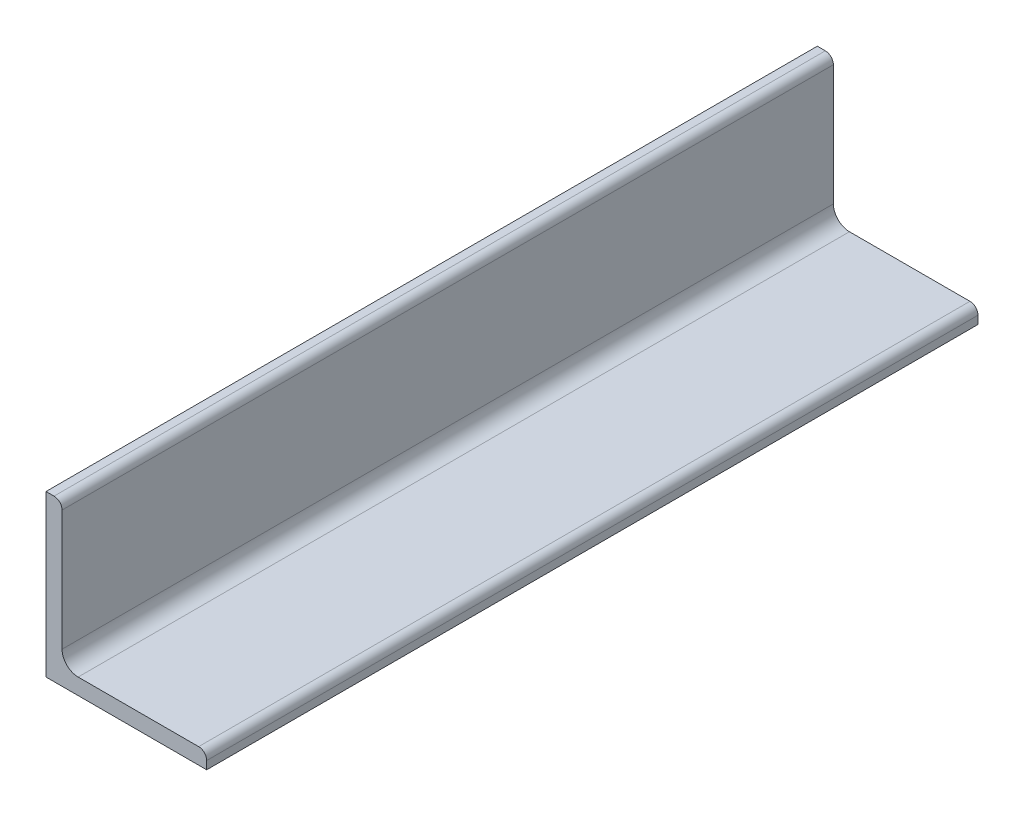
ISO-10303-21;
HEADER;
FILE_DESCRIPTION(('STEP AP214'),'2;1');
FILE_NAME('part.step','',(''),(''),'','','');
FILE_SCHEMA(('AUTOMOTIVE_DESIGN { 1 0 10303 214 1 1 1 1 }'));
ENDSEC;
DATA;
#1=APPLICATION_CONTEXT('core data for automotive mechanical design processes');
#2=APPLICATION_PROTOCOL_DEFINITION('international standard','automotive_design',2000,#1);
#3=PRODUCT_CONTEXT('',#1,'mechanical');
#4=PRODUCT('Part','Part','',(#3));
#5=PRODUCT_RELATED_PRODUCT_CATEGORY('part','',(#4));
#6=PRODUCT_DEFINITION_FORMATION('','',#4);
#7=PRODUCT_DEFINITION_CONTEXT('part definition',#1,'design');
#8=PRODUCT_DEFINITION('design','',#6,#7);
#9=PRODUCT_DEFINITION_SHAPE('','',#8);
#10=(LENGTH_UNIT() NAMED_UNIT(*) SI_UNIT(.MILLI.,.METRE.));
#11=(NAMED_UNIT(*) PLANE_ANGLE_UNIT() SI_UNIT($,.RADIAN.));
#12=(NAMED_UNIT(*) SI_UNIT($,.STERADIAN.) SOLID_ANGLE_UNIT());
#13=UNCERTAINTY_MEASURE_WITH_UNIT(LENGTH_MEASURE(1.E-05),#10,'distance_accuracy_value','');
#14=(GEOMETRIC_REPRESENTATION_CONTEXT(3) GLOBAL_UNCERTAINTY_ASSIGNED_CONTEXT((#13)) GLOBAL_UNIT_ASSIGNED_CONTEXT((#10,
#11,#12)) REPRESENTATION_CONTEXT('',''));
#15=CARTESIAN_POINT('',(0.,0.,0.));
#16=DIRECTION('',(0.,0.,1.));
#17=DIRECTION('',(1.,0.,0.));
#18=AXIS2_PLACEMENT_3D('',#15,#16,#17);
#19=CARTESIAN_POINT('',(0.897927251325018,63.8534276781816,304.8));
#20=DIRECTION('',(1.,0.,0.));
#21=DIRECTION('',(0.,0.,-1.));
#22=AXIS2_PLACEMENT_3D('',#19,#20,#21);
#23=PLANE('',#22);
#24=DIRECTION('',(0.,-1.,0.));
#25=VECTOR('',#24,1.);
#26=CARTESIAN_POINT('',(0.897927251325018,63.8534276781816,0.));
#27=LINE('',#26,#25);
#28=CARTESIAN_POINT('',(0.897927251325018,63.8534276781816,0.));
#29=VERTEX_POINT('',#28);
#30=CARTESIAN_POINT('',(0.897927251325018,0.353427678181561,0.));
#31=VERTEX_POINT('',#30);
#32=EDGE_CURVE('E135',#29,#31,#27,.T.);
#33=ORIENTED_EDGE('',*,*,#32,.T.);
#34=DIRECTION('',(0.,0.,-1.));
#35=VECTOR('',#34,1.);
#36=CARTESIAN_POINT('',(0.897927251325018,0.353427678181561,304.8));
#37=LINE('',#36,#35);
#38=CARTESIAN_POINT('',(0.897927251325018,0.353427678181561,304.8));
#39=VERTEX_POINT('',#38);
#40=EDGE_CURVE('E11',#39,#31,#37,.T.);
#41=ORIENTED_EDGE('',*,*,#40,.F.);
#42=DIRECTION('',(0.,-1.,0.));
#43=VECTOR('',#42,1.);
#44=CARTESIAN_POINT('',(0.897927251325018,63.8534276781816,304.8));
#45=LINE('',#44,#43);
#46=CARTESIAN_POINT('',(0.897927251325018,63.8534276781816,304.8));
#47=VERTEX_POINT('',#46);
#48=EDGE_CURVE('E151',#47,#39,#45,.T.);
#49=ORIENTED_EDGE('',*,*,#48,.F.);
#50=DIRECTION('',(0.,0.,-1.));
#51=VECTOR('',#50,1.);
#52=CARTESIAN_POINT('',(0.897927251325018,63.8534276781816,304.8));
#53=LINE('',#52,#51);
#54=EDGE_CURVE('E131',#47,#29,#53,.T.);
#55=ORIENTED_EDGE('',*,*,#54,.T.);
#56=EDGE_LOOP('',(#33,#41,#49,#55));
#57=FACE_BOUND('',#56,.T.);
#58=ADVANCED_FACE('F33',(#57),#23,.F.);
#59=CARTESIAN_POINT('',(0.897927251325018,0.353427678181561,304.8));
#60=DIRECTION('',(0.,1.,0.));
#61=DIRECTION('',(0.,0.,1.));
#62=AXIS2_PLACEMENT_3D('',#59,#60,#61);
#63=PLANE('',#62);
#64=DIRECTION('',(1.,0.,0.));
#65=VECTOR('',#64,1.);
#66=CARTESIAN_POINT('',(0.897927251325018,0.353427678181561,0.));
#67=LINE('',#66,#65);
#68=CARTESIAN_POINT('',(64.397927251325,0.353427678181561,0.));
#69=VERTEX_POINT('',#68);
#70=EDGE_CURVE('E138',#31,#69,#67,.T.);
#71=ORIENTED_EDGE('',*,*,#70,.T.);
#72=DIRECTION('',(0.,0.,-1.));
#73=VECTOR('',#72,1.);
#74=CARTESIAN_POINT('',(64.397927251325,0.353427678181561,304.8));
#75=LINE('',#74,#73);
#76=CARTESIAN_POINT('',(64.397927251325,0.353427678181561,304.8));
#77=VERTEX_POINT('',#76);
#78=EDGE_CURVE('E41',#77,#69,#75,.T.);
#79=ORIENTED_EDGE('',*,*,#78,.F.);
#80=DIRECTION('',(1.,0.,0.));
#81=VECTOR('',#80,1.);
#82=CARTESIAN_POINT('',(0.897927251325018,0.353427678181561,304.8));
#83=LINE('',#82,#81);
#84=EDGE_CURVE('E95',#39,#77,#83,.T.);
#85=ORIENTED_EDGE('',*,*,#84,.F.);
#86=ORIENTED_EDGE('',*,*,#40,.T.);
#87=EDGE_LOOP('',(#71,#79,#85,#86));
#88=FACE_BOUND('',#87,.T.);
#89=ADVANCED_FACE('F194',(#88),#63,.F.);
#90=CARTESIAN_POINT('',(64.397927251325,0.353427678181561,304.8));
#91=DIRECTION('',(-1.,0.,0.));
#92=DIRECTION('',(0.,0.,1.));
#93=AXIS2_PLACEMENT_3D('',#90,#91,#92);
#94=PLANE('',#93);
#95=DIRECTION('',(0.,1.,0.));
#96=VECTOR('',#95,1.);
#97=CARTESIAN_POINT('',(64.397927251325,0.353427678181561,0.));
#98=LINE('',#97,#96);
#99=CARTESIAN_POINT('',(64.397927251325,3.52842767818156,0.));
#100=VERTEX_POINT('',#99);
#101=EDGE_CURVE('E140',#69,#100,#98,.T.);
#102=ORIENTED_EDGE('',*,*,#101,.T.);
#103=DIRECTION('',(0.,0.,-1.));
#104=VECTOR('',#103,1.);
#105=CARTESIAN_POINT('',(64.397927251325,3.52842767818156,304.8));
#106=LINE('',#105,#104);
#107=CARTESIAN_POINT('',(64.397927251325,3.52842767818156,304.8));
#108=VERTEX_POINT('',#107);
#109=EDGE_CURVE('E161',#108,#100,#106,.T.);
#110=ORIENTED_EDGE('',*,*,#109,.F.);
#111=DIRECTION('',(0.,1.,0.));
#112=VECTOR('',#111,1.);
#113=CARTESIAN_POINT('',(64.397927251325,0.353427678181561,304.8));
#114=LINE('',#113,#112);
#115=EDGE_CURVE('E169',#77,#108,#114,.T.);
#116=ORIENTED_EDGE('',*,*,#115,.F.);
#117=ORIENTED_EDGE('',*,*,#78,.T.);
#118=EDGE_LOOP('',(#102,#110,#116,#117));
#119=FACE_BOUND('',#118,.T.);
#120=ADVANCED_FACE('F167',(#119),#94,.F.);
#121=CARTESIAN_POINT('',(61.222927251325,3.52842767818156,304.8));
#122=DIRECTION('',(0.,0.,-1.));
#123=DIRECTION('',(-1.,0.,0.));
#124=AXIS2_PLACEMENT_3D('',#121,#122,#123);
#125=CYLINDRICAL_SURFACE('',#124,3.175);
#126=CARTESIAN_POINT('',(61.222927251325,3.52842767818156,0.));
#127=DIRECTION('',(0.,0.,1.));
#128=DIRECTION('',(1.,0.,0.));
#129=AXIS2_PLACEMENT_3D('',#126,#127,#128);
#130=CIRCLE('',#129,3.175);
#131=CARTESIAN_POINT('',(61.222927251325,6.70342767818156,0.));
#132=VERTEX_POINT('',#131);
#133=EDGE_CURVE('E142',#100,#132,#130,.T.);
#134=ORIENTED_EDGE('',*,*,#133,.T.);
#135=DIRECTION('',(0.,0.,-1.));
#136=VECTOR('',#135,1.);
#137=CARTESIAN_POINT('',(61.222927251325,6.70342767818156,304.8));
#138=LINE('',#137,#136);
#139=CARTESIAN_POINT('',(61.222927251325,6.70342767818156,304.8));
#140=VERTEX_POINT('',#139);
#141=EDGE_CURVE('E158',#140,#132,#138,.T.);
#142=ORIENTED_EDGE('',*,*,#141,.F.);
#143=CARTESIAN_POINT('',(61.222927251325,3.52842767818156,304.8));
#144=DIRECTION('',(0.,0.,1.));
#145=DIRECTION('',(1.,0.,0.));
#146=AXIS2_PLACEMENT_3D('',#143,#144,#145);
#147=CIRCLE('',#146,3.175);
#148=EDGE_CURVE('E185',#108,#140,#147,.T.);
#149=ORIENTED_EDGE('',*,*,#148,.F.);
#150=ORIENTED_EDGE('',*,*,#109,.T.);
#151=EDGE_LOOP('',(#134,#142,#149,#150));
#152=FACE_BOUND('',#151,.T.);
#153=ADVANCED_FACE('F178',(#152),#125,.T.);
#154=CARTESIAN_POINT('',(61.222927251325,6.70342767818156,304.8));
#155=DIRECTION('',(0.,-1.,0.));
#156=DIRECTION('',(0.,0.,-1.));
#157=AXIS2_PLACEMENT_3D('',#154,#155,#156);
#158=PLANE('',#157);
#159=DIRECTION('',(-1.,0.,0.));
#160=VECTOR('',#159,1.);
#161=CARTESIAN_POINT('',(61.222927251325,6.70342767818156,0.));
#162=LINE('',#161,#160);
#163=CARTESIAN_POINT('',(13.597927251325,6.70342767818156,0.));
#164=VERTEX_POINT('',#163);
#165=EDGE_CURVE('E144',#132,#164,#162,.T.);
#166=ORIENTED_EDGE('',*,*,#165,.T.);
#167=DIRECTION('',(0.,0.,-1.));
#168=VECTOR('',#167,1.);
#169=CARTESIAN_POINT('',(13.597927251325,6.70342767818156,304.8));
#170=LINE('',#169,#168);
#171=CARTESIAN_POINT('',(13.597927251325,6.70342767818156,304.8));
#172=VERTEX_POINT('',#171);
#173=EDGE_CURVE('E155',#172,#164,#170,.T.);
#174=ORIENTED_EDGE('',*,*,#173,.F.);
#175=DIRECTION('',(-1.,0.,0.));
#176=VECTOR('',#175,1.);
#177=CARTESIAN_POINT('',(61.222927251325,6.70342767818156,304.8));
#178=LINE('',#177,#176);
#179=EDGE_CURVE('E184',#140,#172,#178,.T.);
#180=ORIENTED_EDGE('',*,*,#179,.F.);
#181=ORIENTED_EDGE('',*,*,#141,.T.);
#182=EDGE_LOOP('',(#166,#174,#180,#181));
#183=FACE_BOUND('',#182,.T.);
#184=ADVANCED_FACE('F182',(#183),#158,.F.);
#185=CARTESIAN_POINT('',(13.597927251325,13.0534276781816,304.8));
#186=DIRECTION('',(0.,0.,-1.));
#187=DIRECTION('',(-1.,0.,0.));
#188=AXIS2_PLACEMENT_3D('',#185,#186,#187);
#189=CYLINDRICAL_SURFACE('',#188,6.34999999999999);
#190=CARTESIAN_POINT('',(13.597927251325,13.0534276781816,0.));
#191=DIRECTION('',(0.,0.,-1.));
#192=DIRECTION('',(1.,0.,0.));
#193=AXIS2_PLACEMENT_3D('',#190,#191,#192);
#194=CIRCLE('',#193,6.34999999999999);
#195=CARTESIAN_POINT('',(7.24792725132502,13.0534276781816,0.));
#196=VERTEX_POINT('',#195);
#197=EDGE_CURVE('E146',#164,#196,#194,.T.);
#198=ORIENTED_EDGE('',*,*,#197,.T.);
#199=DIRECTION('',(0.,0.,-1.));
#200=VECTOR('',#199,1.);
#201=CARTESIAN_POINT('',(7.24792725132502,13.0534276781816,304.8));
#202=LINE('',#201,#200);
#203=CARTESIAN_POINT('',(7.24792725132502,13.0534276781816,304.8));
#204=VERTEX_POINT('',#203);
#205=EDGE_CURVE('E126',#204,#196,#202,.T.);
#206=ORIENTED_EDGE('',*,*,#205,.F.);
#207=CARTESIAN_POINT('',(13.597927251325,13.0534276781816,304.8));
#208=DIRECTION('',(0.,0.,-1.));
#209=DIRECTION('',(1.,0.,0.));
#210=AXIS2_PLACEMENT_3D('',#207,#208,#209);
#211=CIRCLE('',#210,6.34999999999999);
#212=EDGE_CURVE('E117',#172,#204,#211,.T.);
#213=ORIENTED_EDGE('',*,*,#212,.F.);
#214=ORIENTED_EDGE('',*,*,#173,.T.);
#215=EDGE_LOOP('',(#198,#206,#213,#214));
#216=FACE_BOUND('',#215,.T.);
#217=ADVANCED_FACE('F206',(#216),#189,.F.);
#218=CARTESIAN_POINT('',(7.24792725132502,13.0534276781816,304.8));
#219=DIRECTION('',(-1.,0.,0.));
#220=DIRECTION('',(0.,0.,1.));
#221=AXIS2_PLACEMENT_3D('',#218,#219,#220);
#222=PLANE('',#221);
#223=DIRECTION('',(0.,1.,0.));
#224=VECTOR('',#223,1.);
#225=CARTESIAN_POINT('',(7.24792725132502,13.0534276781816,0.));
#226=LINE('',#225,#224);
#227=CARTESIAN_POINT('',(7.24792725132502,60.6784276781816,0.));
#228=VERTEX_POINT('',#227);
#229=EDGE_CURVE('E125',#196,#228,#226,.T.);
#230=ORIENTED_EDGE('',*,*,#229,.T.);
#231=DIRECTION('',(0.,0.,-1.));
#232=VECTOR('',#231,1.);
#233=CARTESIAN_POINT('',(7.24792725132502,60.6784276781816,304.8));
#234=LINE('',#233,#232);
#235=CARTESIAN_POINT('',(7.24792725132502,60.6784276781816,304.8));
#236=VERTEX_POINT('',#235);
#237=EDGE_CURVE('E122',#236,#228,#234,.T.);
#238=ORIENTED_EDGE('',*,*,#237,.F.);
#239=DIRECTION('',(0.,1.,0.));
#240=VECTOR('',#239,1.);
#241=CARTESIAN_POINT('',(7.24792725132502,13.0534276781816,304.8));
#242=LINE('',#241,#240);
#243=EDGE_CURVE('E111',#204,#236,#242,.T.);
#244=ORIENTED_EDGE('',*,*,#243,.F.);
#245=ORIENTED_EDGE('',*,*,#205,.T.);
#246=EDGE_LOOP('',(#230,#238,#244,#245));
#247=FACE_BOUND('',#246,.T.);
#248=ADVANCED_FACE('F123',(#247),#222,.F.);
#249=CARTESIAN_POINT('',(4.07292725132502,60.6784276781816,304.8));
#250=DIRECTION('',(0.,0.,-1.));
#251=DIRECTION('',(-1.,0.,0.));
#252=AXIS2_PLACEMENT_3D('',#249,#250,#251);
#253=CYLINDRICAL_SURFACE('',#252,3.175);
#254=CARTESIAN_POINT('',(4.07292725132502,60.6784276781816,0.));
#255=DIRECTION('',(0.,0.,1.));
#256=DIRECTION('',(1.,0.,0.));
#257=AXIS2_PLACEMENT_3D('',#254,#255,#256);
#258=CIRCLE('',#257,3.175);
#259=CARTESIAN_POINT('',(4.07292725132502,63.8534276781816,0.));
#260=VERTEX_POINT('',#259);
#261=EDGE_CURVE('E81',#228,#260,#258,.T.);
#262=ORIENTED_EDGE('',*,*,#261,.T.);
#263=DIRECTION('',(0.,0.,-1.));
#264=VECTOR('',#263,1.);
#265=CARTESIAN_POINT('',(4.07292725132502,63.8534276781816,304.8));
#266=LINE('',#265,#264);
#267=CARTESIAN_POINT('',(4.07292725132502,63.8534276781816,304.8));
#268=VERTEX_POINT('',#267);
#269=EDGE_CURVE('E127',#268,#260,#266,.T.);
#270=ORIENTED_EDGE('',*,*,#269,.F.);
#271=CARTESIAN_POINT('',(4.07292725132502,60.6784276781816,304.8));
#272=DIRECTION('',(0.,0.,1.));
#273=DIRECTION('',(1.,0.,0.));
#274=AXIS2_PLACEMENT_3D('',#271,#272,#273);
#275=CIRCLE('',#274,3.175);
#276=EDGE_CURVE('E115',#236,#268,#275,.T.);
#277=ORIENTED_EDGE('',*,*,#276,.F.);
#278=ORIENTED_EDGE('',*,*,#237,.T.);
#279=EDGE_LOOP('',(#262,#270,#277,#278));
#280=FACE_BOUND('',#279,.T.);
#281=ADVANCED_FACE('F129',(#280),#253,.T.);
#282=CARTESIAN_POINT('',(4.07292725132502,63.8534276781816,304.8));
#283=DIRECTION('',(0.,-1.,0.));
#284=DIRECTION('',(0.,0.,-1.));
#285=AXIS2_PLACEMENT_3D('',#282,#283,#284);
#286=PLANE('',#285);
#287=DIRECTION('',(-1.,0.,0.));
#288=VECTOR('',#287,1.);
#289=CARTESIAN_POINT('',(4.07292725132502,63.8534276781816,0.));
#290=LINE('',#289,#288);
#291=EDGE_CURVE('E87',#260,#29,#290,.T.);
#292=ORIENTED_EDGE('',*,*,#291,.T.);
#293=ORIENTED_EDGE('',*,*,#54,.F.);
#294=DIRECTION('',(-1.,0.,0.));
#295=VECTOR('',#294,1.);
#296=CARTESIAN_POINT('',(4.07292725132502,63.8534276781816,304.8));
#297=LINE('',#296,#295);
#298=EDGE_CURVE('E49',#268,#47,#297,.T.);
#299=ORIENTED_EDGE('',*,*,#298,.F.);
#300=ORIENTED_EDGE('',*,*,#269,.T.);
#301=EDGE_LOOP('',(#292,#293,#299,#300));
#302=FACE_BOUND('',#301,.T.);
#303=ADVANCED_FACE('F214',(#302),#286,.F.);
#304=CARTESIAN_POINT('',(61.222927251325,3.52842767818156,304.8));
#305=DIRECTION('',(0.,0.,1.));
#306=DIRECTION('',(1.,0.,0.));
#307=AXIS2_PLACEMENT_3D('',#304,#305,#306);
#308=PLANE('',#307);
#309=ORIENTED_EDGE('',*,*,#48,.T.);
#310=ORIENTED_EDGE('',*,*,#84,.T.);
#311=ORIENTED_EDGE('',*,*,#115,.T.);
#312=ORIENTED_EDGE('',*,*,#148,.T.);
#313=ORIENTED_EDGE('',*,*,#179,.T.);
#314=ORIENTED_EDGE('',*,*,#212,.T.);
#315=ORIENTED_EDGE('',*,*,#243,.T.);
#316=ORIENTED_EDGE('',*,*,#276,.T.);
#317=ORIENTED_EDGE('',*,*,#298,.T.);
#318=EDGE_LOOP('',(#309,#310,#311,#312,#313,#314,#315,#316,#317));
#319=FACE_BOUND('',#318,.T.);
#320=ADVANCED_FACE('F113',(#319),#308,.T.);
#321=CARTESIAN_POINT('',(61.222927251325,3.52842767818156,0.));
#322=DIRECTION('',(0.,0.,1.));
#323=DIRECTION('',(1.,0.,0.));
#324=AXIS2_PLACEMENT_3D('',#321,#322,#323);
#325=PLANE('',#324);
#326=ORIENTED_EDGE('',*,*,#32,.F.);
#327=ORIENTED_EDGE('',*,*,#291,.F.);
#328=ORIENTED_EDGE('',*,*,#261,.F.);
#329=ORIENTED_EDGE('',*,*,#229,.F.);
#330=ORIENTED_EDGE('',*,*,#197,.F.);
#331=ORIENTED_EDGE('',*,*,#165,.F.);
#332=ORIENTED_EDGE('',*,*,#133,.F.);
#333=ORIENTED_EDGE('',*,*,#101,.F.);
#334=ORIENTED_EDGE('',*,*,#70,.F.);
#335=EDGE_LOOP('',(#326,#327,#328,#329,#330,#331,#332,#333,#334));
#336=FACE_BOUND('',#335,.T.);
#337=ADVANCED_FACE('F173',(#336),#325,.F.);
#338=CLOSED_SHELL('',(#58,#89,#120,#153,#184,#217,#248,#281,#303,#320,#337));
#339=MANIFOLD_SOLID_BREP('B2',#338);
#340=ADVANCED_BREP_SHAPE_REPRESENTATION('',(#18,#339),#14);
#341=SHAPE_DEFINITION_REPRESENTATION(#9,#340);
ENDSEC;
END-ISO-10303-21;
